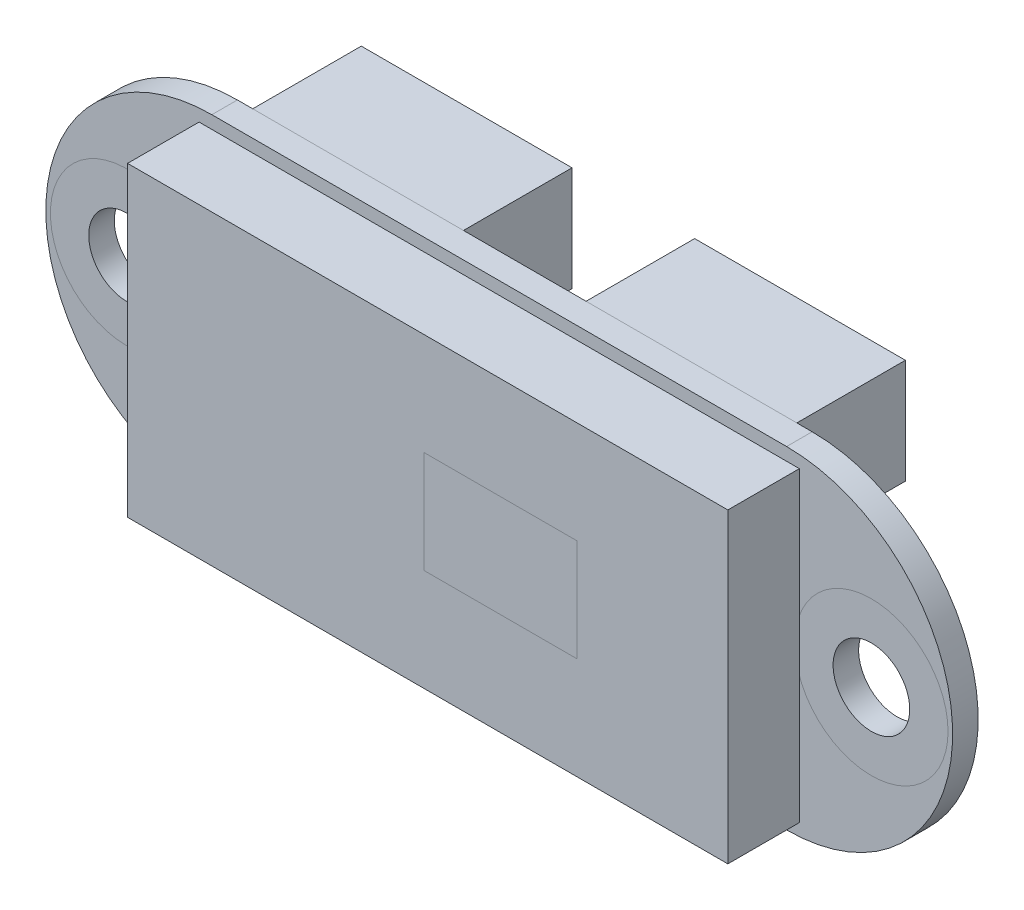
ISO-10303-21;
HEADER;
FILE_DESCRIPTION(('STEP AP214'),'2;1');
FILE_NAME('part.step','',(''),(''),'','','');
FILE_SCHEMA(('AUTOMOTIVE_DESIGN { 1 0 10303 214 1 1 1 1 }'));
ENDSEC;
DATA;
#1=APPLICATION_CONTEXT('core data for automotive mechanical design processes');
#2=APPLICATION_PROTOCOL_DEFINITION('international standard','automotive_design',2000,#1);
#3=PRODUCT_CONTEXT('',#1,'mechanical');
#4=PRODUCT('Part','Part','',(#3));
#5=PRODUCT_RELATED_PRODUCT_CATEGORY('part','',(#4));
#6=PRODUCT_DEFINITION_FORMATION('','',#4);
#7=PRODUCT_DEFINITION_CONTEXT('part definition',#1,'design');
#8=PRODUCT_DEFINITION('design','',#6,#7);
#9=PRODUCT_DEFINITION_SHAPE('','',#8);
#10=(LENGTH_UNIT() NAMED_UNIT(*) SI_UNIT(.MILLI.,.METRE.));
#11=(NAMED_UNIT(*) PLANE_ANGLE_UNIT() SI_UNIT($,.RADIAN.));
#12=(NAMED_UNIT(*) SI_UNIT($,.STERADIAN.) SOLID_ANGLE_UNIT());
#13=UNCERTAINTY_MEASURE_WITH_UNIT(LENGTH_MEASURE(1.E-05),#10,'distance_accuracy_value','');
#14=(GEOMETRIC_REPRESENTATION_CONTEXT(3) GLOBAL_UNCERTAINTY_ASSIGNED_CONTEXT((#13)) GLOBAL_UNIT_ASSIGNED_CONTEXT((#10,
#11,#12)) REPRESENTATION_CONTEXT('',''));
#15=CARTESIAN_POINT('',(0.,0.,0.));
#16=DIRECTION('',(0.,0.,1.));
#17=DIRECTION('',(1.,0.,0.));
#18=AXIS2_PLACEMENT_3D('',#15,#16,#17);
#19=CARTESIAN_POINT('',(-40.6608038878916,21.8666569572126,-4.25));
#20=DIRECTION('',(-1.,0.,0.));
#21=DIRECTION('',(0.,0.,1.));
#22=AXIS2_PLACEMENT_3D('',#19,#20,#21);
#23=PLANE('',#22);
#24=DIRECTION('',(0.,-1.,0.));
#25=VECTOR('',#24,1.);
#26=CARTESIAN_POINT('',(-40.6608038878916,21.8666569572126,0.));
#27=LINE('',#26,#25);
#28=CARTESIAN_POINT('',(-40.6608038878916,21.8666569572126,0.));
#29=VERTEX_POINT('',#28);
#30=CARTESIAN_POINT('',(-40.6608038878916,17.7666569572126,0.));
#31=VERTEX_POINT('',#30);
#32=EDGE_CURVE('E115',#29,#31,#27,.T.);
#33=ORIENTED_EDGE('',*,*,#32,.T.);
#34=DIRECTION('',(0.,0.,1.));
#35=VECTOR('',#34,1.);
#36=CARTESIAN_POINT('',(-40.6608038878916,17.7666569572126,-4.25));
#37=LINE('',#36,#35);
#38=CARTESIAN_POINT('',(-40.6608038878916,17.7666569572126,-4.25));
#39=VERTEX_POINT('',#38);
#40=EDGE_CURVE('E12',#39,#31,#37,.T.);
#41=ORIENTED_EDGE('',*,*,#40,.F.);
#42=DIRECTION('',(0.,-1.,0.));
#43=VECTOR('',#42,1.);
#44=CARTESIAN_POINT('',(-40.6608038878916,21.8666569572126,-4.25));
#45=LINE('',#44,#43);
#46=CARTESIAN_POINT('',(-40.6608038878916,21.8666569572126,-4.25));
#47=VERTEX_POINT('',#46);
#48=EDGE_CURVE('E103',#47,#39,#45,.T.);
#49=ORIENTED_EDGE('',*,*,#48,.F.);
#50=DIRECTION('',(0.,0.,1.));
#51=VECTOR('',#50,1.);
#52=CARTESIAN_POINT('',(-40.6608038878916,21.8666569572126,-4.25));
#53=LINE('',#52,#51);
#54=EDGE_CURVE('E111',#47,#29,#53,.T.);
#55=ORIENTED_EDGE('',*,*,#54,.T.);
#56=EDGE_LOOP('',(#33,#41,#49,#55));
#57=FACE_BOUND('',#56,.T.);
#58=ADVANCED_FACE('F52',(#57),#23,.F.);
#59=CARTESIAN_POINT('',(-40.6608038878916,17.7666569572126,-4.25));
#60=DIRECTION('',(0.,1.,0.));
#61=DIRECTION('',(0.,0.,1.));
#62=AXIS2_PLACEMENT_3D('',#59,#60,#61);
#63=PLANE('',#62);
#64=DIRECTION('',(-1.,0.,0.));
#65=VECTOR('',#64,1.);
#66=CARTESIAN_POINT('',(-40.6608038878916,17.7666569572126,0.));
#67=LINE('',#66,#65);
#68=CARTESIAN_POINT('',(-48.9108038878916,17.7666569572126,0.));
#69=VERTEX_POINT('',#68);
#70=EDGE_CURVE('E107',#31,#69,#67,.T.);
#71=ORIENTED_EDGE('',*,*,#70,.T.);
#72=DIRECTION('',(0.,0.,1.));
#73=VECTOR('',#72,1.);
#74=CARTESIAN_POINT('',(-48.9108038878916,17.7666569572126,-4.25));
#75=LINE('',#74,#73);
#76=CARTESIAN_POINT('',(-48.9108038878916,17.7666569572126,-4.25));
#77=VERTEX_POINT('',#76);
#78=EDGE_CURVE('E60',#77,#69,#75,.T.);
#79=ORIENTED_EDGE('',*,*,#78,.F.);
#80=DIRECTION('',(-1.,0.,0.));
#81=VECTOR('',#80,1.);
#82=CARTESIAN_POINT('',(-40.6608038878916,17.7666569572126,-4.25));
#83=LINE('',#82,#81);
#84=EDGE_CURVE('E98',#39,#77,#83,.T.);
#85=ORIENTED_EDGE('',*,*,#84,.F.);
#86=ORIENTED_EDGE('',*,*,#40,.T.);
#87=EDGE_LOOP('',(#71,#79,#85,#86));
#88=FACE_BOUND('',#87,.T.);
#89=ADVANCED_FACE('F106',(#88),#63,.F.);
#90=CARTESIAN_POINT('',(-48.9108038878916,21.8666569572126,-4.25));
#91=DIRECTION('',(1.,0.,0.));
#92=DIRECTION('',(0.,0.,-1.));
#93=AXIS2_PLACEMENT_3D('',#90,#91,#92);
#94=PLANE('',#93);
#95=DIRECTION('',(0.,1.,0.));
#96=VECTOR('',#95,1.);
#97=CARTESIAN_POINT('',(-48.9108038878916,21.8666569572126,0.));
#98=LINE('',#97,#96);
#99=CARTESIAN_POINT('',(-48.9108038878916,21.8666569572126,0.));
#100=VERTEX_POINT('',#99);
#101=EDGE_CURVE('E85',#69,#100,#98,.T.);
#102=ORIENTED_EDGE('',*,*,#101,.T.);
#103=DIRECTION('',(0.,0.,1.));
#104=VECTOR('',#103,1.);
#105=CARTESIAN_POINT('',(-48.9108038878916,21.8666569572126,-4.25));
#106=LINE('',#105,#104);
#107=CARTESIAN_POINT('',(-48.9108038878916,21.8666569572126,-4.25));
#108=VERTEX_POINT('',#107);
#109=EDGE_CURVE('E108',#108,#100,#106,.T.);
#110=ORIENTED_EDGE('',*,*,#109,.F.);
#111=DIRECTION('',(0.,1.,0.));
#112=VECTOR('',#111,1.);
#113=CARTESIAN_POINT('',(-48.9108038878916,21.8666569572126,-4.25));
#114=LINE('',#113,#112);
#115=EDGE_CURVE('E101',#77,#108,#114,.T.);
#116=ORIENTED_EDGE('',*,*,#115,.F.);
#117=ORIENTED_EDGE('',*,*,#78,.T.);
#118=EDGE_LOOP('',(#102,#110,#116,#117));
#119=FACE_BOUND('',#118,.T.);
#120=ADVANCED_FACE('F109',(#119),#94,.F.);
#121=CARTESIAN_POINT('',(-40.6608038878916,21.8666569572126,-4.25));
#122=DIRECTION('',(0.,-1.,0.));
#123=DIRECTION('',(0.,0.,-1.));
#124=AXIS2_PLACEMENT_3D('',#121,#122,#123);
#125=PLANE('',#124);
#126=DIRECTION('',(1.,0.,0.));
#127=VECTOR('',#126,1.);
#128=CARTESIAN_POINT('',(-40.6608038878916,21.8666569572126,0.));
#129=LINE('',#128,#127);
#130=EDGE_CURVE('E91',#100,#29,#129,.T.);
#131=ORIENTED_EDGE('',*,*,#130,.T.);
#132=ORIENTED_EDGE('',*,*,#54,.F.);
#133=DIRECTION('',(1.,0.,0.));
#134=VECTOR('',#133,1.);
#135=CARTESIAN_POINT('',(-40.6608038878916,21.8666569572126,-4.25));
#136=LINE('',#135,#134);
#137=EDGE_CURVE('E68',#108,#47,#136,.T.);
#138=ORIENTED_EDGE('',*,*,#137,.F.);
#139=ORIENTED_EDGE('',*,*,#109,.T.);
#140=EDGE_LOOP('',(#131,#132,#138,#139));
#141=FACE_BOUND('',#140,.T.);
#142=ADVANCED_FACE('F122',(#141),#125,.F.);
#143=CARTESIAN_POINT('',(0.,0.,-4.25));
#144=DIRECTION('',(0.,0.,-1.));
#145=DIRECTION('',(-1.,0.,0.));
#146=AXIS2_PLACEMENT_3D('',#143,#144,#145);
#147=PLANE('',#146);
#148=ORIENTED_EDGE('',*,*,#48,.T.);
#149=ORIENTED_EDGE('',*,*,#84,.T.);
#150=ORIENTED_EDGE('',*,*,#115,.T.);
#151=ORIENTED_EDGE('',*,*,#137,.T.);
#152=EDGE_LOOP('',(#148,#149,#150,#151));
#153=FACE_BOUND('',#152,.T.);
#154=ADVANCED_FACE('F99',(#153),#147,.T.);
#155=CARTESIAN_POINT('',(0.,0.,0.));
#156=DIRECTION('',(0.,0.,-1.));
#157=DIRECTION('',(-1.,0.,0.));
#158=AXIS2_PLACEMENT_3D('',#155,#156,#157);
#159=PLANE('',#158);
#160=ORIENTED_EDGE('',*,*,#32,.F.);
#161=ORIENTED_EDGE('',*,*,#130,.F.);
#162=ORIENTED_EDGE('',*,*,#101,.F.);
#163=ORIENTED_EDGE('',*,*,#70,.F.);
#164=EDGE_LOOP('',(#160,#161,#162,#163));
#165=FACE_BOUND('',#164,.T.);
#166=ADVANCED_FACE('F125',(#165),#159,.F.);
#167=CLOSED_SHELL('',(#58,#89,#120,#142,#154,#166));
#168=MANIFOLD_SOLID_BREP('B2',#167);
#169=CARTESIAN_POINT('',(-27.6108038878916,21.8666569572126,-4.25));
#170=DIRECTION('',(-1.,0.,0.));
#171=DIRECTION('',(0.,-1.,0.));
#172=AXIS2_PLACEMENT_3D('',#169,#170,#171);
#173=PLANE('',#172);
#174=DIRECTION('',(0.,-1.,0.));
#175=VECTOR('',#174,1.);
#176=CARTESIAN_POINT('',(-27.6108038878916,21.8666569572126,0.));
#177=LINE('',#176,#175);
#178=CARTESIAN_POINT('',(-27.6108038878916,21.8666569572126,0.));
#179=VERTEX_POINT('',#178);
#180=CARTESIAN_POINT('',(-27.6108038878916,17.7666569572126,0.));
#181=VERTEX_POINT('',#180);
#182=EDGE_CURVE('E249',#179,#181,#177,.T.);
#183=ORIENTED_EDGE('',*,*,#182,.T.);
#184=DIRECTION('',(0.,0.,1.));
#185=VECTOR('',#184,1.);
#186=CARTESIAN_POINT('',(-27.6108038878916,17.7666569572126,-4.25));
#187=LINE('',#186,#185);
#188=CARTESIAN_POINT('',(-27.6108038878916,17.7666569572126,-4.25));
#189=VERTEX_POINT('',#188);
#190=EDGE_CURVE('E50',#189,#181,#187,.T.);
#191=ORIENTED_EDGE('',*,*,#190,.F.);
#192=DIRECTION('',(0.,-1.,0.));
#193=VECTOR('',#192,1.);
#194=CARTESIAN_POINT('',(-27.6108038878916,21.8666569572126,-4.25));
#195=LINE('',#194,#193);
#196=CARTESIAN_POINT('',(-27.6108038878916,21.8666569572126,-4.25));
#197=VERTEX_POINT('',#196);
#198=EDGE_CURVE('E237',#197,#189,#195,.T.);
#199=ORIENTED_EDGE('',*,*,#198,.F.);
#200=DIRECTION('',(0.,0.,1.));
#201=VECTOR('',#200,1.);
#202=CARTESIAN_POINT('',(-27.6108038878916,21.8666569572126,-4.25));
#203=LINE('',#202,#201);
#204=EDGE_CURVE('E245',#197,#179,#203,.T.);
#205=ORIENTED_EDGE('',*,*,#204,.T.);
#206=EDGE_LOOP('',(#183,#191,#199,#205));
#207=FACE_BOUND('',#206,.T.);
#208=ADVANCED_FACE('F186',(#207),#173,.F.);
#209=CARTESIAN_POINT('',(-27.6108038878916,17.7666569572126,-4.25));
#210=DIRECTION('',(0.,1.,0.));
#211=DIRECTION('',(0.,0.,1.));
#212=AXIS2_PLACEMENT_3D('',#209,#210,#211);
#213=PLANE('',#212);
#214=DIRECTION('',(-1.,0.,0.));
#215=VECTOR('',#214,1.);
#216=CARTESIAN_POINT('',(-27.6108038878916,17.7666569572126,0.));
#217=LINE('',#216,#215);
#218=CARTESIAN_POINT('',(-35.8608038878916,17.7666569572126,0.));
#219=VERTEX_POINT('',#218);
#220=EDGE_CURVE('E241',#181,#219,#217,.T.);
#221=ORIENTED_EDGE('',*,*,#220,.T.);
#222=DIRECTION('',(0.,0.,1.));
#223=VECTOR('',#222,1.);
#224=CARTESIAN_POINT('',(-35.8608038878916,17.7666569572126,-4.25));
#225=LINE('',#224,#223);
#226=CARTESIAN_POINT('',(-35.8608038878916,17.7666569572126,-4.25));
#227=VERTEX_POINT('',#226);
#228=EDGE_CURVE('E194',#227,#219,#225,.T.);
#229=ORIENTED_EDGE('',*,*,#228,.F.);
#230=DIRECTION('',(-1.,0.,0.));
#231=VECTOR('',#230,1.);
#232=CARTESIAN_POINT('',(-27.6108038878916,17.7666569572126,-4.25));
#233=LINE('',#232,#231);
#234=EDGE_CURVE('E232',#189,#227,#233,.T.);
#235=ORIENTED_EDGE('',*,*,#234,.F.);
#236=ORIENTED_EDGE('',*,*,#190,.T.);
#237=EDGE_LOOP('',(#221,#229,#235,#236));
#238=FACE_BOUND('',#237,.T.);
#239=ADVANCED_FACE('F240',(#238),#213,.F.);
#240=CARTESIAN_POINT('',(-35.8608038878916,21.8666569572126,-4.25));
#241=DIRECTION('',(1.,0.,0.));
#242=DIRECTION('',(0.,1.,0.));
#243=AXIS2_PLACEMENT_3D('',#240,#241,#242);
#244=PLANE('',#243);
#245=DIRECTION('',(0.,1.,0.));
#246=VECTOR('',#245,1.);
#247=CARTESIAN_POINT('',(-35.8608038878916,21.8666569572126,0.));
#248=LINE('',#247,#246);
#249=CARTESIAN_POINT('',(-35.8608038878916,21.8666569572126,0.));
#250=VERTEX_POINT('',#249);
#251=EDGE_CURVE('E219',#219,#250,#248,.T.);
#252=ORIENTED_EDGE('',*,*,#251,.T.);
#253=DIRECTION('',(0.,0.,1.));
#254=VECTOR('',#253,1.);
#255=CARTESIAN_POINT('',(-35.8608038878916,21.8666569572126,-4.25));
#256=LINE('',#255,#254);
#257=CARTESIAN_POINT('',(-35.8608038878916,21.8666569572126,-4.25));
#258=VERTEX_POINT('',#257);
#259=EDGE_CURVE('E242',#258,#250,#256,.T.);
#260=ORIENTED_EDGE('',*,*,#259,.F.);
#261=DIRECTION('',(0.,1.,0.));
#262=VECTOR('',#261,1.);
#263=CARTESIAN_POINT('',(-35.8608038878916,21.8666569572126,-4.25));
#264=LINE('',#263,#262);
#265=EDGE_CURVE('E235',#227,#258,#264,.T.);
#266=ORIENTED_EDGE('',*,*,#265,.F.);
#267=ORIENTED_EDGE('',*,*,#228,.T.);
#268=EDGE_LOOP('',(#252,#260,#266,#267));
#269=FACE_BOUND('',#268,.T.);
#270=ADVANCED_FACE('F243',(#269),#244,.F.);
#271=CARTESIAN_POINT('',(-27.6108038878916,21.8666569572126,-4.25));
#272=DIRECTION('',(0.,-1.,0.));
#273=DIRECTION('',(0.,0.,-1.));
#274=AXIS2_PLACEMENT_3D('',#271,#272,#273);
#275=PLANE('',#274);
#276=DIRECTION('',(1.,0.,0.));
#277=VECTOR('',#276,1.);
#278=CARTESIAN_POINT('',(-27.6108038878916,21.8666569572126,0.));
#279=LINE('',#278,#277);
#280=EDGE_CURVE('E225',#250,#179,#279,.T.);
#281=ORIENTED_EDGE('',*,*,#280,.T.);
#282=ORIENTED_EDGE('',*,*,#204,.F.);
#283=DIRECTION('',(1.,0.,0.));
#284=VECTOR('',#283,1.);
#285=CARTESIAN_POINT('',(-27.6108038878916,21.8666569572126,-4.25));
#286=LINE('',#285,#284);
#287=EDGE_CURVE('E202',#258,#197,#286,.T.);
#288=ORIENTED_EDGE('',*,*,#287,.F.);
#289=ORIENTED_EDGE('',*,*,#259,.T.);
#290=EDGE_LOOP('',(#281,#282,#288,#289));
#291=FACE_BOUND('',#290,.T.);
#292=ADVANCED_FACE('F256',(#291),#275,.F.);
#293=CARTESIAN_POINT('',(0.,0.,-4.25));
#294=DIRECTION('',(0.,0.,-1.));
#295=DIRECTION('',(-1.,0.,0.));
#296=AXIS2_PLACEMENT_3D('',#293,#294,#295);
#297=PLANE('',#296);
#298=ORIENTED_EDGE('',*,*,#198,.T.);
#299=ORIENTED_EDGE('',*,*,#234,.T.);
#300=ORIENTED_EDGE('',*,*,#265,.T.);
#301=ORIENTED_EDGE('',*,*,#287,.T.);
#302=EDGE_LOOP('',(#298,#299,#300,#301));
#303=FACE_BOUND('',#302,.T.);
#304=ADVANCED_FACE('F233',(#303),#297,.T.);
#305=CARTESIAN_POINT('',(0.,0.,0.));
#306=DIRECTION('',(0.,0.,-1.));
#307=DIRECTION('',(-1.,0.,0.));
#308=AXIS2_PLACEMENT_3D('',#305,#306,#307);
#309=PLANE('',#308);
#310=ORIENTED_EDGE('',*,*,#182,.F.);
#311=ORIENTED_EDGE('',*,*,#280,.F.);
#312=ORIENTED_EDGE('',*,*,#251,.F.);
#313=ORIENTED_EDGE('',*,*,#220,.F.);
#314=EDGE_LOOP('',(#310,#311,#312,#313));
#315=FACE_BOUND('',#314,.T.);
#316=ADVANCED_FACE('F259',(#315),#309,.F.);
#317=CLOSED_SHELL('',(#208,#239,#270,#292,#304,#316));
#318=MANIFOLD_SOLID_BREP('B6',#317);
#319=CARTESIAN_POINT('',(-38.4108038878916,17.3666569572126,1.));
#320=DIRECTION('',(-1.,0.,0.));
#321=DIRECTION('',(0.,0.,1.));
#322=AXIS2_PLACEMENT_3D('',#319,#320,#321);
#323=PLANE('',#322);
#324=DIRECTION('',(0.,-1.,0.));
#325=VECTOR('',#324,1.);
#326=CARTESIAN_POINT('',(-38.4108038878916,17.3666569572126,3.8));
#327=LINE('',#326,#325);
#328=CARTESIAN_POINT('',(-38.4108038878916,17.3666569572126,3.8));
#329=VERTEX_POINT('',#328);
#330=CARTESIAN_POINT('',(-38.4108038878916,13.3666569572126,3.8));
#331=VERTEX_POINT('',#330);
#332=EDGE_CURVE('E384',#329,#331,#327,.T.);
#333=ORIENTED_EDGE('',*,*,#332,.F.);
#334=DIRECTION('',(0.,0.,1.));
#335=VECTOR('',#334,1.);
#336=CARTESIAN_POINT('',(-38.4108038878916,17.3666569572126,1.));
#337=LINE('',#336,#335);
#338=CARTESIAN_POINT('',(-38.4108038878916,17.3666569572126,1.));
#339=VERTEX_POINT('',#338);
#340=EDGE_CURVE('E184',#339,#329,#337,.T.);
#341=ORIENTED_EDGE('',*,*,#340,.F.);
#342=DIRECTION('',(0.,-1.,0.));
#343=VECTOR('',#342,1.);
#344=CARTESIAN_POINT('',(-38.4108038878916,17.3666569572126,1.));
#345=LINE('',#344,#343);
#346=CARTESIAN_POINT('',(-38.4108038878916,13.3666569572126,1.));
#347=VERTEX_POINT('',#346);
#348=EDGE_CURVE('E378',#339,#347,#345,.T.);
#349=ORIENTED_EDGE('',*,*,#348,.T.);
#350=DIRECTION('',(0.,0.,1.));
#351=VECTOR('',#350,1.);
#352=CARTESIAN_POINT('',(-38.4108038878916,13.3666569572126,1.));
#353=LINE('',#352,#351);
#354=EDGE_CURVE('E323',#347,#331,#353,.T.);
#355=ORIENTED_EDGE('',*,*,#354,.T.);
#356=EDGE_LOOP('',(#333,#341,#349,#355));
#357=FACE_BOUND('',#356,.T.);
#358=ADVANCED_FACE('F320',(#357),#323,.T.);
#359=CARTESIAN_POINT('',(-38.4108038878916,17.3666569572126,1.));
#360=DIRECTION('',(0.,1.,0.));
#361=DIRECTION('',(0.,0.,1.));
#362=AXIS2_PLACEMENT_3D('',#359,#360,#361);
#363=PLANE('',#362);
#364=DIRECTION('',(-1.,0.,0.));
#365=VECTOR('',#364,1.);
#366=CARTESIAN_POINT('',(-38.4108038878916,17.3666569572126,3.8));
#367=LINE('',#366,#365);
#368=CARTESIAN_POINT('',(-32.4108038878916,17.3666569572126,3.8));
#369=VERTEX_POINT('',#368);
#370=EDGE_CURVE('E380',#369,#329,#367,.T.);
#371=ORIENTED_EDGE('',*,*,#370,.F.);
#372=DIRECTION('',(0.,0.,1.));
#373=VECTOR('',#372,1.);
#374=CARTESIAN_POINT('',(-32.4108038878916,17.3666569572126,1.));
#375=LINE('',#374,#373);
#376=CARTESIAN_POINT('',(-32.4108038878916,17.3666569572126,1.));
#377=VERTEX_POINT('',#376);
#378=EDGE_CURVE('E329',#377,#369,#375,.T.);
#379=ORIENTED_EDGE('',*,*,#378,.F.);
#380=DIRECTION('',(-1.,0.,0.));
#381=VECTOR('',#380,1.);
#382=CARTESIAN_POINT('',(-38.4108038878916,17.3666569572126,1.));
#383=LINE('',#382,#381);
#384=EDGE_CURVE('E375',#377,#339,#383,.T.);
#385=ORIENTED_EDGE('',*,*,#384,.T.);
#386=ORIENTED_EDGE('',*,*,#340,.T.);
#387=EDGE_LOOP('',(#371,#379,#385,#386));
#388=FACE_BOUND('',#387,.T.);
#389=ADVANCED_FACE('F394',(#388),#363,.T.);
#390=CARTESIAN_POINT('',(-32.4108038878916,17.3666569572126,1.));
#391=DIRECTION('',(1.,0.,0.));
#392=DIRECTION('',(0.,0.,-1.));
#393=AXIS2_PLACEMENT_3D('',#390,#391,#392);
#394=PLANE('',#393);
#395=DIRECTION('',(0.,1.,0.));
#396=VECTOR('',#395,1.);
#397=CARTESIAN_POINT('',(-32.4108038878916,17.3666569572126,3.8));
#398=LINE('',#397,#396);
#399=CARTESIAN_POINT('',(-32.4108038878916,13.3666569572126,3.8));
#400=VERTEX_POINT('',#399);
#401=EDGE_CURVE('E370',#400,#369,#398,.T.);
#402=ORIENTED_EDGE('',*,*,#401,.F.);
#403=DIRECTION('',(0.,0.,1.));
#404=VECTOR('',#403,1.);
#405=CARTESIAN_POINT('',(-32.4108038878916,13.3666569572126,1.));
#406=LINE('',#405,#404);
#407=CARTESIAN_POINT('',(-32.4108038878916,13.3666569572126,1.));
#408=VERTEX_POINT('',#407);
#409=EDGE_CURVE('E365',#408,#400,#406,.T.);
#410=ORIENTED_EDGE('',*,*,#409,.F.);
#411=DIRECTION('',(0.,1.,0.));
#412=VECTOR('',#411,1.);
#413=CARTESIAN_POINT('',(-32.4108038878916,17.3666569572126,1.));
#414=LINE('',#413,#412);
#415=EDGE_CURVE('E368',#408,#377,#414,.T.);
#416=ORIENTED_EDGE('',*,*,#415,.T.);
#417=ORIENTED_EDGE('',*,*,#378,.T.);
#418=EDGE_LOOP('',(#402,#410,#416,#417));
#419=FACE_BOUND('',#418,.T.);
#420=ADVANCED_FACE('F367',(#419),#394,.T.);
#421=CARTESIAN_POINT('',(-38.4108038878916,13.3666569572126,1.));
#422=DIRECTION('',(0.,-1.,0.));
#423=DIRECTION('',(0.,0.,-1.));
#424=AXIS2_PLACEMENT_3D('',#421,#422,#423);
#425=PLANE('',#424);
#426=DIRECTION('',(1.,0.,0.));
#427=VECTOR('',#426,1.);
#428=CARTESIAN_POINT('',(-38.4108038878916,13.3666569572126,3.8));
#429=LINE('',#428,#427);
#430=EDGE_CURVE('E387',#331,#400,#429,.T.);
#431=ORIENTED_EDGE('',*,*,#430,.F.);
#432=ORIENTED_EDGE('',*,*,#354,.F.);
#433=DIRECTION('',(1.,0.,0.));
#434=VECTOR('',#433,1.);
#435=CARTESIAN_POINT('',(-38.4108038878916,13.3666569572126,1.));
#436=LINE('',#435,#434);
#437=EDGE_CURVE('E374',#347,#408,#436,.T.);
#438=ORIENTED_EDGE('',*,*,#437,.T.);
#439=ORIENTED_EDGE('',*,*,#409,.T.);
#440=EDGE_LOOP('',(#431,#432,#438,#439));
#441=FACE_BOUND('',#440,.T.);
#442=ADVANCED_FACE('F377',(#441),#425,.T.);
#443=CARTESIAN_POINT('',(0.,0.,1.));
#444=DIRECTION('',(0.,0.,1.));
#445=DIRECTION('',(1.,0.,0.));
#446=AXIS2_PLACEMENT_3D('',#443,#444,#445);
#447=PLANE('',#446);
#448=ORIENTED_EDGE('',*,*,#348,.F.);
#449=ORIENTED_EDGE('',*,*,#384,.F.);
#450=ORIENTED_EDGE('',*,*,#415,.F.);
#451=ORIENTED_EDGE('',*,*,#437,.F.);
#452=EDGE_LOOP('',(#448,#449,#450,#451));
#453=FACE_BOUND('',#452,.T.);
#454=ADVANCED_FACE('F373',(#453),#447,.F.);
#455=CARTESIAN_POINT('',(0.,0.,3.8));
#456=DIRECTION('',(0.,0.,1.));
#457=DIRECTION('',(1.,0.,0.));
#458=AXIS2_PLACEMENT_3D('',#455,#456,#457);
#459=PLANE('',#458);
#460=ORIENTED_EDGE('',*,*,#332,.T.);
#461=ORIENTED_EDGE('',*,*,#430,.T.);
#462=ORIENTED_EDGE('',*,*,#401,.T.);
#463=ORIENTED_EDGE('',*,*,#370,.T.);
#464=EDGE_LOOP('',(#460,#461,#462,#463));
#465=FACE_BOUND('',#464,.T.);
#466=ADVANCED_FACE('F393',(#465),#459,.T.);
#467=CLOSED_SHELL('',(#358,#389,#420,#442,#454,#466));
#468=MANIFOLD_SOLID_BREP('B44',#467);
#469=CARTESIAN_POINT('',(0.,0.,3.8));
#470=DIRECTION('',(0.,0.,1.));
#471=DIRECTION('',(1.,0.,0.));
#472=AXIS2_PLACEMENT_3D('',#469,#470,#471);
#473=PLANE('',#472);
#474=DIRECTION('',(0.,-1.,0.));
#475=VECTOR('',#474,1.);
#476=CARTESIAN_POINT('',(-50.0108038878916,21.3666569572126,3.8));
#477=LINE('',#476,#475);
#478=CARTESIAN_POINT('',(-50.0108038878916,21.3666569572126,3.8));
#479=VERTEX_POINT('',#478);
#480=CARTESIAN_POINT('',(-50.0108038878916,9.36665695721256,3.8));
#481=VERTEX_POINT('',#480);
#482=EDGE_CURVE('E566',#479,#481,#477,.T.);
#483=ORIENTED_EDGE('',*,*,#482,.T.);
#484=DIRECTION('',(1.,0.,0.));
#485=VECTOR('',#484,1.);
#486=CARTESIAN_POINT('',(-50.0108038878916,9.36665695721256,3.8));
#487=LINE('',#486,#485);
#488=CARTESIAN_POINT('',(-26.5108038878916,9.36665695721257,3.8));
#489=VERTEX_POINT('',#488);
#490=EDGE_CURVE('E570',#481,#489,#487,.T.);
#491=ORIENTED_EDGE('',*,*,#490,.T.);
#492=DIRECTION('',(0.,1.,0.));
#493=VECTOR('',#492,1.);
#494=CARTESIAN_POINT('',(-26.5108038878916,21.3666569572126,3.8));
#495=LINE('',#494,#493);
#496=CARTESIAN_POINT('',(-26.5108038878916,21.3666569572126,3.8));
#497=VERTEX_POINT('',#496);
#498=EDGE_CURVE('E574',#489,#497,#495,.T.);
#499=ORIENTED_EDGE('',*,*,#498,.T.);
#500=DIRECTION('',(-1.,0.,0.));
#501=VECTOR('',#500,1.);
#502=CARTESIAN_POINT('',(-50.0108038878916,21.3666569572126,3.8));
#503=LINE('',#502,#501);
#504=EDGE_CURVE('E577',#497,#479,#503,.T.);
#505=ORIENTED_EDGE('',*,*,#504,.T.);
#506=EDGE_LOOP('',(#483,#491,#499,#505));
#507=FACE_BOUND('',#506,.T.);
#508=DIRECTION('',(1.,0.,0.));
#509=VECTOR('',#508,1.);
#510=CARTESIAN_POINT('',(-38.4108038878916,13.3666569572126,3.8));
#511=LINE('',#510,#509);
#512=CARTESIAN_POINT('',(-38.4108038878916,13.3666569572126,3.8));
#513=VERTEX_POINT('',#512);
#514=CARTESIAN_POINT('',(-32.4108038878916,13.3666569572126,3.8));
#515=VERTEX_POINT('',#514);
#516=EDGE_CURVE('E527',#513,#515,#511,.T.);
#517=ORIENTED_EDGE('',*,*,#516,.F.);
#518=DIRECTION('',(0.,-1.,0.));
#519=VECTOR('',#518,1.);
#520=CARTESIAN_POINT('',(-38.4108038878916,17.3666569572126,3.8));
#521=LINE('',#520,#519);
#522=CARTESIAN_POINT('',(-38.4108038878916,17.3666569572126,3.8));
#523=VERTEX_POINT('',#522);
#524=EDGE_CURVE('E518',#523,#513,#521,.T.);
#525=ORIENTED_EDGE('',*,*,#524,.F.);
#526=DIRECTION('',(-1.,0.,0.));
#527=VECTOR('',#526,1.);
#528=CARTESIAN_POINT('',(-38.4108038878916,17.3666569572126,3.8));
#529=LINE('',#528,#527);
#530=CARTESIAN_POINT('',(-32.4108038878916,17.3666569572126,3.8));
#531=VERTEX_POINT('',#530);
#532=EDGE_CURVE('E544',#531,#523,#529,.T.);
#533=ORIENTED_EDGE('',*,*,#532,.F.);
#534=DIRECTION('',(0.,1.,0.));
#535=VECTOR('',#534,1.);
#536=CARTESIAN_POINT('',(-32.4108038878916,17.3666569572126,3.8));
#537=LINE('',#536,#535);
#538=EDGE_CURVE('E540',#515,#531,#537,.T.);
#539=ORIENTED_EDGE('',*,*,#538,.F.);
#540=EDGE_LOOP('',(#517,#525,#533,#539));
#541=FACE_BOUND('',#540,.T.);
#542=ADVANCED_FACE('F452',(#507,#541),#473,.T.);
#543=CARTESIAN_POINT('',(0.,0.,1.));
#544=DIRECTION('',(0.,0.,1.));
#545=DIRECTION('',(1.,0.,0.));
#546=AXIS2_PLACEMENT_3D('',#543,#544,#545);
#547=PLANE('',#546);
#548=DIRECTION('',(0.,-1.,0.));
#549=VECTOR('',#548,1.);
#550=CARTESIAN_POINT('',(-50.0108038878916,21.3666569572126,1.));
#551=LINE('',#550,#549);
#552=CARTESIAN_POINT('',(-50.0108038878916,21.3666569572126,1.));
#553=VERTEX_POINT('',#552);
#554=CARTESIAN_POINT('',(-50.0108038878916,9.36665695721256,1.));
#555=VERTEX_POINT('',#554);
#556=EDGE_CURVE('E536',#553,#555,#551,.T.);
#557=ORIENTED_EDGE('',*,*,#556,.F.);
#558=DIRECTION('',(-1.,0.,0.));
#559=VECTOR('',#558,1.);
#560=CARTESIAN_POINT('',(-50.0108038878916,21.3666569572126,1.));
#561=LINE('',#560,#559);
#562=CARTESIAN_POINT('',(-26.5108038878916,21.3666569572126,1.));
#563=VERTEX_POINT('',#562);
#564=EDGE_CURVE('E571',#563,#553,#561,.T.);
#565=ORIENTED_EDGE('',*,*,#564,.F.);
#566=DIRECTION('',(0.,1.,0.));
#567=VECTOR('',#566,1.);
#568=CARTESIAN_POINT('',(-26.5108038878916,21.3666569572126,1.));
#569=LINE('',#568,#567);
#570=CARTESIAN_POINT('',(-26.5108038878916,9.36665695721257,1.));
#571=VERTEX_POINT('',#570);
#572=EDGE_CURVE('E587',#571,#563,#569,.T.);
#573=ORIENTED_EDGE('',*,*,#572,.F.);
#574=DIRECTION('',(1.,0.,0.));
#575=VECTOR('',#574,1.);
#576=CARTESIAN_POINT('',(-50.0108038878916,9.36665695721256,1.));
#577=LINE('',#576,#575);
#578=EDGE_CURVE('E584',#555,#571,#577,.T.);
#579=ORIENTED_EDGE('',*,*,#578,.F.);
#580=EDGE_LOOP('',(#557,#565,#573,#579));
#581=FACE_BOUND('',#580,.T.);
#582=DIRECTION('',(0.,-1.,0.));
#583=VECTOR('',#582,1.);
#584=CARTESIAN_POINT('',(-38.4108038878916,17.3666569572126,1.));
#585=LINE('',#584,#583);
#586=CARTESIAN_POINT('',(-38.4108038878916,17.3666569572126,1.));
#587=VERTEX_POINT('',#586);
#588=CARTESIAN_POINT('',(-38.4108038878916,13.3666569572126,1.));
#589=VERTEX_POINT('',#588);
#590=EDGE_CURVE('E476',#587,#589,#585,.T.);
#591=ORIENTED_EDGE('',*,*,#590,.T.);
#592=DIRECTION('',(1.,0.,0.));
#593=VECTOR('',#592,1.);
#594=CARTESIAN_POINT('',(-38.4108038878916,13.3666569572126,1.));
#595=LINE('',#594,#593);
#596=CARTESIAN_POINT('',(-32.4108038878916,13.3666569572126,1.));
#597=VERTEX_POINT('',#596);
#598=EDGE_CURVE('E534',#589,#597,#595,.T.);
#599=ORIENTED_EDGE('',*,*,#598,.T.);
#600=DIRECTION('',(0.,1.,0.));
#601=VECTOR('',#600,1.);
#602=CARTESIAN_POINT('',(-32.4108038878916,17.3666569572126,1.));
#603=LINE('',#602,#601);
#604=CARTESIAN_POINT('',(-32.4108038878916,17.3666569572126,1.));
#605=VERTEX_POINT('',#604);
#606=EDGE_CURVE('E553',#597,#605,#603,.T.);
#607=ORIENTED_EDGE('',*,*,#606,.T.);
#608=DIRECTION('',(-1.,0.,0.));
#609=VECTOR('',#608,1.);
#610=CARTESIAN_POINT('',(-38.4108038878916,17.3666569572126,1.));
#611=LINE('',#610,#609);
#612=EDGE_CURVE('E528',#605,#587,#611,.T.);
#613=ORIENTED_EDGE('',*,*,#612,.T.);
#614=EDGE_LOOP('',(#591,#599,#607,#613));
#615=FACE_BOUND('',#614,.T.);
#616=ADVANCED_FACE('F610',(#581,#615),#547,.F.);
#617=CARTESIAN_POINT('',(-50.0108038878916,21.3666569572126,3.8));
#618=DIRECTION('',(1.,0.,0.));
#619=DIRECTION('',(0.,1.,0.));
#620=AXIS2_PLACEMENT_3D('',#617,#618,#619);
#621=PLANE('',#620);
#622=ORIENTED_EDGE('',*,*,#556,.T.);
#623=DIRECTION('',(0.,0.,-1.));
#624=VECTOR('',#623,1.);
#625=CARTESIAN_POINT('',(-50.0108038878916,9.36665695721256,3.8));
#626=LINE('',#625,#624);
#627=EDGE_CURVE('E318',#481,#555,#626,.T.);
#628=ORIENTED_EDGE('',*,*,#627,.F.);
#629=ORIENTED_EDGE('',*,*,#482,.F.);
#630=DIRECTION('',(0.,0.,-1.));
#631=VECTOR('',#630,1.);
#632=CARTESIAN_POINT('',(-50.0108038878916,21.3666569572126,3.8));
#633=LINE('',#632,#631);
#634=EDGE_CURVE('E580',#479,#553,#633,.T.);
#635=ORIENTED_EDGE('',*,*,#634,.T.);
#636=EDGE_LOOP('',(#622,#628,#629,#635));
#637=FACE_BOUND('',#636,.T.);
#638=ADVANCED_FACE('F454',(#637),#621,.F.);
#639=CARTESIAN_POINT('',(-50.0108038878916,9.36665695721256,3.8));
#640=DIRECTION('',(0.,1.,0.));
#641=DIRECTION('',(-1.,0.,0.));
#642=AXIS2_PLACEMENT_3D('',#639,#640,#641);
#643=PLANE('',#642);
#644=ORIENTED_EDGE('',*,*,#578,.T.);
#645=DIRECTION('',(0.,0.,-1.));
#646=VECTOR('',#645,1.);
#647=CARTESIAN_POINT('',(-26.5108038878916,9.36665695721257,3.8));
#648=LINE('',#647,#646);
#649=EDGE_CURVE('E461',#489,#571,#648,.T.);
#650=ORIENTED_EDGE('',*,*,#649,.F.);
#651=ORIENTED_EDGE('',*,*,#490,.F.);
#652=ORIENTED_EDGE('',*,*,#627,.T.);
#653=EDGE_LOOP('',(#644,#650,#651,#652));
#654=FACE_BOUND('',#653,.T.);
#655=ADVANCED_FACE('F620',(#654),#643,.F.);
#656=CARTESIAN_POINT('',(-26.5108038878916,21.3666569572126,3.8));
#657=DIRECTION('',(-1.,0.,0.));
#658=DIRECTION('',(0.,-1.,0.));
#659=AXIS2_PLACEMENT_3D('',#656,#657,#658);
#660=PLANE('',#659);
#661=ORIENTED_EDGE('',*,*,#572,.T.);
#662=DIRECTION('',(0.,0.,-1.));
#663=VECTOR('',#662,1.);
#664=CARTESIAN_POINT('',(-26.5108038878916,21.3666569572126,3.8));
#665=LINE('',#664,#663);
#666=EDGE_CURVE('E595',#497,#563,#665,.T.);
#667=ORIENTED_EDGE('',*,*,#666,.F.);
#668=ORIENTED_EDGE('',*,*,#498,.F.);
#669=ORIENTED_EDGE('',*,*,#649,.T.);
#670=EDGE_LOOP('',(#661,#667,#668,#669));
#671=FACE_BOUND('',#670,.T.);
#672=ADVANCED_FACE('F604',(#671),#660,.F.);
#673=CARTESIAN_POINT('',(-50.0108038878916,21.3666569572126,3.8));
#674=DIRECTION('',(0.,-1.,0.));
#675=DIRECTION('',(1.,0.,0.));
#676=AXIS2_PLACEMENT_3D('',#673,#674,#675);
#677=PLANE('',#676);
#678=ORIENTED_EDGE('',*,*,#564,.T.);
#679=ORIENTED_EDGE('',*,*,#634,.F.);
#680=ORIENTED_EDGE('',*,*,#504,.F.);
#681=ORIENTED_EDGE('',*,*,#666,.T.);
#682=EDGE_LOOP('',(#678,#679,#680,#681));
#683=FACE_BOUND('',#682,.T.);
#684=ADVANCED_FACE('F614',(#683),#677,.F.);
#685=CARTESIAN_POINT('',(-38.4108038878916,17.3666569572126,3.8));
#686=DIRECTION('',(1.,0.,0.));
#687=DIRECTION('',(0.,1.,0.));
#688=AXIS2_PLACEMENT_3D('',#685,#686,#687);
#689=PLANE('',#688);
#690=ORIENTED_EDGE('',*,*,#590,.F.);
#691=DIRECTION('',(0.,0.,-1.));
#692=VECTOR('',#691,1.);
#693=CARTESIAN_POINT('',(-38.4108038878916,17.3666569572126,3.8));
#694=LINE('',#693,#692);
#695=EDGE_CURVE('E522',#523,#587,#694,.T.);
#696=ORIENTED_EDGE('',*,*,#695,.F.);
#697=ORIENTED_EDGE('',*,*,#524,.T.);
#698=DIRECTION('',(0.,0.,-1.));
#699=VECTOR('',#698,1.);
#700=CARTESIAN_POINT('',(-38.4108038878916,13.3666569572126,3.8));
#701=LINE('',#700,#699);
#702=EDGE_CURVE('E521',#513,#589,#701,.T.);
#703=ORIENTED_EDGE('',*,*,#702,.T.);
#704=EDGE_LOOP('',(#690,#696,#697,#703));
#705=FACE_BOUND('',#704,.T.);
#706=ADVANCED_FACE('F520',(#705),#689,.T.);
#707=CARTESIAN_POINT('',(-38.4108038878916,13.3666569572126,3.8));
#708=DIRECTION('',(0.,1.,0.));
#709=DIRECTION('',(0.,0.,1.));
#710=AXIS2_PLACEMENT_3D('',#707,#708,#709);
#711=PLANE('',#710);
#712=ORIENTED_EDGE('',*,*,#598,.F.);
#713=ORIENTED_EDGE('',*,*,#702,.F.);
#714=ORIENTED_EDGE('',*,*,#516,.T.);
#715=DIRECTION('',(0.,0.,-1.));
#716=VECTOR('',#715,1.);
#717=CARTESIAN_POINT('',(-32.4108038878916,13.3666569572126,3.8));
#718=LINE('',#717,#716);
#719=EDGE_CURVE('E537',#515,#597,#718,.T.);
#720=ORIENTED_EDGE('',*,*,#719,.T.);
#721=EDGE_LOOP('',(#712,#713,#714,#720));
#722=FACE_BOUND('',#721,.T.);
#723=ADVANCED_FACE('F531',(#722),#711,.T.);
#724=CARTESIAN_POINT('',(-32.4108038878916,17.3666569572126,3.8));
#725=DIRECTION('',(-1.,0.,0.));
#726=DIRECTION('',(0.,0.,1.));
#727=AXIS2_PLACEMENT_3D('',#724,#725,#726);
#728=PLANE('',#727);
#729=ORIENTED_EDGE('',*,*,#606,.F.);
#730=ORIENTED_EDGE('',*,*,#719,.F.);
#731=ORIENTED_EDGE('',*,*,#538,.T.);
#732=DIRECTION('',(0.,0.,-1.));
#733=VECTOR('',#732,1.);
#734=CARTESIAN_POINT('',(-32.4108038878916,17.3666569572126,3.8));
#735=LINE('',#734,#733);
#736=EDGE_CURVE('E468',#531,#605,#735,.T.);
#737=ORIENTED_EDGE('',*,*,#736,.T.);
#738=EDGE_LOOP('',(#729,#730,#731,#737));
#739=FACE_BOUND('',#738,.T.);
#740=ADVANCED_FACE('F643',(#739),#728,.T.);
#741=CARTESIAN_POINT('',(-38.4108038878916,17.3666569572126,3.8));
#742=DIRECTION('',(0.,-1.,0.));
#743=DIRECTION('',(1.,0.,0.));
#744=AXIS2_PLACEMENT_3D('',#741,#742,#743);
#745=PLANE('',#744);
#746=ORIENTED_EDGE('',*,*,#612,.F.);
#747=ORIENTED_EDGE('',*,*,#736,.F.);
#748=ORIENTED_EDGE('',*,*,#532,.T.);
#749=ORIENTED_EDGE('',*,*,#695,.T.);
#750=EDGE_LOOP('',(#746,#747,#748,#749));
#751=FACE_BOUND('',#750,.T.);
#752=ADVANCED_FACE('F647',(#751),#745,.T.);
#753=CLOSED_SHELL('',(#542,#616,#638,#655,#672,#684,#706,#723,#740,#752));
#754=MANIFOLD_SOLID_BREP('B178',#753);
#755=CARTESIAN_POINT('',(-52.8308038878916,15.3666569572126,0.));
#756=DIRECTION('',(0.,0.,1.));
#757=DIRECTION('',(1.,0.,0.));
#758=AXIS2_PLACEMENT_3D('',#755,#756,#757);
#759=CYLINDRICAL_SURFACE('',#758,3.);
#760=CARTESIAN_POINT('',(-52.8308038878916,15.3666569572126,0.));
#761=DIRECTION('',(0.,0.,1.));
#762=DIRECTION('',(1.,0.,0.));
#763=AXIS2_PLACEMENT_3D('',#760,#761,#762);
#764=CIRCLE('',#763,3.);
#765=CARTESIAN_POINT('',(-49.8308038878916,15.3666569572126,0.));
#766=VERTEX_POINT('',#765);
#767=EDGE_CURVE('E451',#766,#766,#764,.T.);
#768=ORIENTED_EDGE('',*,*,#767,.T.);
#769=EDGE_LOOP('',(#768));
#770=FACE_BOUND('',#769,.T.);
#771=CARTESIAN_POINT('',(-52.8308038878916,15.3666569572126,1.));
#772=DIRECTION('',(0.,0.,1.));
#773=DIRECTION('',(1.,0.,0.));
#774=AXIS2_PLACEMENT_3D('',#771,#772,#773);
#775=CIRCLE('',#774,3.);
#776=CARTESIAN_POINT('',(-49.8308038878916,15.3666569572126,1.));
#777=VERTEX_POINT('',#776);
#778=EDGE_CURVE('E717',#777,#777,#775,.T.);
#779=ORIENTED_EDGE('',*,*,#778,.F.);
#780=EDGE_LOOP('',(#779));
#781=FACE_BOUND('',#780,.T.);
#782=ADVANCED_FACE('F714',(#770,#781),#759,.T.);
#783=CARTESIAN_POINT('',(-52.8308038878916,15.3666569572126,0.));
#784=DIRECTION('',(0.,0.,1.));
#785=DIRECTION('',(1.,0.,0.));
#786=AXIS2_PLACEMENT_3D('',#783,#784,#785);
#787=PLANE('',#786);
#788=CARTESIAN_POINT('',(-52.8308038878916,15.3666569572126,0.));
#789=DIRECTION('',(0.,0.,1.));
#790=DIRECTION('',(1.,0.,0.));
#791=AXIS2_PLACEMENT_3D('',#788,#789,#790);
#792=CIRCLE('',#791,1.5);
#793=CARTESIAN_POINT('',(-51.3308038878916,15.3666569572126,0.));
#794=VERTEX_POINT('',#793);
#795=EDGE_CURVE('E724',#794,#794,#792,.T.);
#796=ORIENTED_EDGE('',*,*,#795,.T.);
#797=EDGE_LOOP('',(#796));
#798=FACE_BOUND('',#797,.T.);
#799=ORIENTED_EDGE('',*,*,#767,.F.);
#800=EDGE_LOOP('',(#799));
#801=FACE_BOUND('',#800,.T.);
#802=ADVANCED_FACE('F732',(#798,#801),#787,.F.);
#803=CARTESIAN_POINT('',(-52.8308038878916,15.3666569572126,1.));
#804=DIRECTION('',(0.,0.,1.));
#805=DIRECTION('',(1.,0.,0.));
#806=AXIS2_PLACEMENT_3D('',#803,#804,#805);
#807=PLANE('',#806);
#808=CARTESIAN_POINT('',(-52.8308038878916,15.3666569572126,1.));
#809=DIRECTION('',(0.,0.,1.));
#810=DIRECTION('',(1.,0.,0.));
#811=AXIS2_PLACEMENT_3D('',#808,#809,#810);
#812=CIRCLE('',#811,1.5);
#813=CARTESIAN_POINT('',(-51.3308038878916,15.3666569572126,1.));
#814=VERTEX_POINT('',#813);
#815=EDGE_CURVE('E726',#814,#814,#812,.T.);
#816=ORIENTED_EDGE('',*,*,#815,.F.);
#817=EDGE_LOOP('',(#816));
#818=FACE_BOUND('',#817,.T.);
#819=ORIENTED_EDGE('',*,*,#778,.T.);
#820=EDGE_LOOP('',(#819));
#821=FACE_BOUND('',#820,.T.);
#822=ADVANCED_FACE('F738',(#818,#821),#807,.T.);
#823=CARTESIAN_POINT('',(-52.8308038878916,15.3666569572126,0.));
#824=DIRECTION('',(0.,0.,1.));
#825=DIRECTION('',(1.,0.,0.));
#826=AXIS2_PLACEMENT_3D('',#823,#824,#825);
#827=CYLINDRICAL_SURFACE('',#826,1.5);
#828=ORIENTED_EDGE('',*,*,#795,.F.);
#829=EDGE_LOOP('',(#828));
#830=FACE_BOUND('',#829,.T.);
#831=ORIENTED_EDGE('',*,*,#815,.T.);
#832=EDGE_LOOP('',(#831));
#833=FACE_BOUND('',#832,.T.);
#834=ADVANCED_FACE('F735',(#830,#833),#827,.F.);
#835=CLOSED_SHELL('',(#782,#802,#822,#834));
#836=MANIFOLD_SOLID_BREP('B312',#835);
#837=CARTESIAN_POINT('',(-23.6908038878916,15.3666569572126,0.));
#838=DIRECTION('',(0.,0.,1.));
#839=DIRECTION('',(1.,0.,0.));
#840=AXIS2_PLACEMENT_3D('',#837,#838,#839);
#841=CYLINDRICAL_SURFACE('',#840,3.);
#842=CARTESIAN_POINT('',(-23.6908038878916,15.3666569572126,0.));
#843=DIRECTION('',(0.,0.,1.));
#844=DIRECTION('',(1.,0.,0.));
#845=AXIS2_PLACEMENT_3D('',#842,#843,#844);
#846=CIRCLE('',#845,3.);
#847=CARTESIAN_POINT('',(-20.6908038878916,15.3666569572126,0.));
#848=VERTEX_POINT('',#847);
#849=EDGE_CURVE('E713',#848,#848,#846,.T.);
#850=ORIENTED_EDGE('',*,*,#849,.T.);
#851=EDGE_LOOP('',(#850));
#852=FACE_BOUND('',#851,.T.);
#853=CARTESIAN_POINT('',(-23.6908038878916,15.3666569572126,1.));
#854=DIRECTION('',(0.,0.,1.));
#855=DIRECTION('',(1.,0.,0.));
#856=AXIS2_PLACEMENT_3D('',#853,#854,#855);
#857=CIRCLE('',#856,3.);
#858=CARTESIAN_POINT('',(-20.6908038878916,15.3666569572126,1.));
#859=VERTEX_POINT('',#858);
#860=EDGE_CURVE('E788',#859,#859,#857,.T.);
#861=ORIENTED_EDGE('',*,*,#860,.F.);
#862=EDGE_LOOP('',(#861));
#863=FACE_BOUND('',#862,.T.);
#864=ADVANCED_FACE('F785',(#852,#863),#841,.T.);
#865=CARTESIAN_POINT('',(-23.6908038878916,15.3666569572126,0.));
#866=DIRECTION('',(0.,0.,1.));
#867=DIRECTION('',(1.,0.,0.));
#868=AXIS2_PLACEMENT_3D('',#865,#866,#867);
#869=PLANE('',#868);
#870=CARTESIAN_POINT('',(-23.6908038878916,15.3666569572126,0.));
#871=DIRECTION('',(0.,0.,1.));
#872=DIRECTION('',(1.,0.,0.));
#873=AXIS2_PLACEMENT_3D('',#870,#871,#872);
#874=CIRCLE('',#873,1.5);
#875=CARTESIAN_POINT('',(-22.1908038878916,15.3666569572126,0.));
#876=VERTEX_POINT('',#875);
#877=EDGE_CURVE('E795',#876,#876,#874,.T.);
#878=ORIENTED_EDGE('',*,*,#877,.T.);
#879=EDGE_LOOP('',(#878));
#880=FACE_BOUND('',#879,.T.);
#881=ORIENTED_EDGE('',*,*,#849,.F.);
#882=EDGE_LOOP('',(#881));
#883=FACE_BOUND('',#882,.T.);
#884=ADVANCED_FACE('F803',(#880,#883),#869,.F.);
#885=CARTESIAN_POINT('',(-23.6908038878916,15.3666569572126,1.));
#886=DIRECTION('',(0.,0.,1.));
#887=DIRECTION('',(1.,0.,0.));
#888=AXIS2_PLACEMENT_3D('',#885,#886,#887);
#889=PLANE('',#888);
#890=CARTESIAN_POINT('',(-23.6908038878916,15.3666569572126,1.));
#891=DIRECTION('',(0.,0.,1.));
#892=DIRECTION('',(1.,0.,0.));
#893=AXIS2_PLACEMENT_3D('',#890,#891,#892);
#894=CIRCLE('',#893,1.5);
#895=CARTESIAN_POINT('',(-22.1908038878916,15.3666569572126,1.));
#896=VERTEX_POINT('',#895);
#897=EDGE_CURVE('E797',#896,#896,#894,.T.);
#898=ORIENTED_EDGE('',*,*,#897,.F.);
#899=EDGE_LOOP('',(#898));
#900=FACE_BOUND('',#899,.T.);
#901=ORIENTED_EDGE('',*,*,#860,.T.);
#902=EDGE_LOOP('',(#901));
#903=FACE_BOUND('',#902,.T.);
#904=ADVANCED_FACE('F809',(#900,#903),#889,.T.);
#905=CARTESIAN_POINT('',(-23.6908038878916,15.3666569572126,0.));
#906=DIRECTION('',(0.,0.,1.));
#907=DIRECTION('',(1.,0.,0.));
#908=AXIS2_PLACEMENT_3D('',#905,#906,#907);
#909=CYLINDRICAL_SURFACE('',#908,1.5);
#910=ORIENTED_EDGE('',*,*,#877,.F.);
#911=EDGE_LOOP('',(#910));
#912=FACE_BOUND('',#911,.T.);
#913=ORIENTED_EDGE('',*,*,#897,.T.);
#914=EDGE_LOOP('',(#913));
#915=FACE_BOUND('',#914,.T.);
#916=ADVANCED_FACE('F806',(#912,#915),#909,.F.);
#917=CLOSED_SHELL('',(#864,#884,#904,#916));
#918=MANIFOLD_SOLID_BREP('B446',#917);
#919=CARTESIAN_POINT('',(-49.5108038878916,15.3666569572126,1.));
#920=DIRECTION('',(0.,0.,1.));
#921=DIRECTION('',(1.,0.,0.));
#922=AXIS2_PLACEMENT_3D('',#919,#920,#921);
#923=PLANE('',#922);
#924=CARTESIAN_POINT('',(-52.8308038878916,15.3666569572126,1.));
#925=DIRECTION('',(0.,0.,1.));
#926=DIRECTION('',(1.,0.,0.));
#927=AXIS2_PLACEMENT_3D('',#924,#925,#926);
#928=CIRCLE('',#927,3.);
#929=CARTESIAN_POINT('',(-49.8308038878916,15.3666569572126,1.));
#930=VERTEX_POINT('',#929);
#931=EDGE_CURVE('E914',#930,#930,#928,.T.);
#932=ORIENTED_EDGE('',*,*,#931,.F.);
#933=EDGE_LOOP('',(#932));
#934=FACE_BOUND('',#933,.T.);
#935=CARTESIAN_POINT('',(-49.5108038878916,15.3666569572126,1.));
#936=DIRECTION('',(0.,0.,1.));
#937=DIRECTION('',(1.,0.,0.));
#938=AXIS2_PLACEMENT_3D('',#935,#936,#937);
#939=CIRCLE('',#938,6.5);
#940=CARTESIAN_POINT('',(-49.5108038878916,21.8666569572126,1.));
#941=VERTEX_POINT('',#940);
#942=CARTESIAN_POINT('',(-49.5108038878916,8.86665695721256,1.));
#943=VERTEX_POINT('',#942);
#944=EDGE_CURVE('E899',#941,#943,#939,.T.);
#945=ORIENTED_EDGE('',*,*,#944,.T.);
#946=DIRECTION('',(1.,0.,0.));
#947=VECTOR('',#946,1.);
#948=CARTESIAN_POINT('',(-49.5108038878916,8.86665695721256,1.));
#949=LINE('',#948,#947);
#950=CARTESIAN_POINT('',(-27.0108038878916,8.86665695721256,1.));
#951=VERTEX_POINT('',#950);
#952=EDGE_CURVE('E894',#943,#951,#949,.T.);
#953=ORIENTED_EDGE('',*,*,#952,.T.);
#954=CARTESIAN_POINT('',(-27.0108038878916,15.3666569572126,1.));
#955=DIRECTION('',(0.,0.,1.));
#956=DIRECTION('',(1.,0.,0.));
#957=AXIS2_PLACEMENT_3D('',#954,#955,#956);
#958=CIRCLE('',#957,6.5);
#959=CARTESIAN_POINT('',(-27.0108038878916,21.8666569572126,1.));
#960=VERTEX_POINT('',#959);
#961=EDGE_CURVE('E897',#951,#960,#958,.T.);
#962=ORIENTED_EDGE('',*,*,#961,.T.);
#963=DIRECTION('',(-1.,0.,0.));
#964=VECTOR('',#963,1.);
#965=CARTESIAN_POINT('',(-49.5108038878916,21.8666569572126,1.));
#966=LINE('',#965,#964);
#967=EDGE_CURVE('E864',#960,#941,#966,.T.);
#968=ORIENTED_EDGE('',*,*,#967,.T.);
#969=EDGE_LOOP('',(#945,#953,#962,#968));
#970=FACE_BOUND('',#969,.T.);
#971=CARTESIAN_POINT('',(-23.6908038878916,15.3666569572126,1.));
#972=DIRECTION('',(0.,0.,1.));
#973=DIRECTION('',(1.,0.,0.));
#974=AXIS2_PLACEMENT_3D('',#971,#972,#973);
#975=CIRCLE('',#974,3.);
#976=CARTESIAN_POINT('',(-20.6908038878916,15.3666569572126,1.));
#977=VERTEX_POINT('',#976);
#978=EDGE_CURVE('E929',#977,#977,#975,.T.);
#979=ORIENTED_EDGE('',*,*,#978,.F.);
#980=EDGE_LOOP('',(#979));
#981=FACE_BOUND('',#980,.T.);
#982=ADVANCED_FACE('F847',(#934,#970,#981),#923,.T.);
#983=CARTESIAN_POINT('',(-49.5108038878916,15.3666569572126,0.));
#984=DIRECTION('',(0.,0.,1.));
#985=DIRECTION('',(1.,0.,0.));
#986=AXIS2_PLACEMENT_3D('',#983,#984,#985);
#987=PLANE('',#986);
#988=CARTESIAN_POINT('',(-49.5108038878916,15.3666569572126,0.));
#989=DIRECTION('',(0.,0.,1.));
#990=DIRECTION('',(1.,0.,0.));
#991=AXIS2_PLACEMENT_3D('',#988,#989,#990);
#992=CIRCLE('',#991,6.5);
#993=CARTESIAN_POINT('',(-49.5108038878916,21.8666569572126,0.));
#994=VERTEX_POINT('',#993);
#995=CARTESIAN_POINT('',(-49.5108038878916,8.86665695721256,0.));
#996=VERTEX_POINT('',#995);
#997=EDGE_CURVE('E911',#994,#996,#992,.T.);
#998=ORIENTED_EDGE('',*,*,#997,.F.);
#999=DIRECTION('',(-1.,0.,0.));
#1000=VECTOR('',#999,1.);
#1001=CARTESIAN_POINT('',(-49.5108038878916,21.8666569572126,0.));
#1002=LINE('',#1001,#1000);
#1003=CARTESIAN_POINT('',(-27.0108038878916,21.8666569572126,0.));
#1004=VERTEX_POINT('',#1003);
#1005=EDGE_CURVE('E887',#1004,#994,#1002,.T.);
#1006=ORIENTED_EDGE('',*,*,#1005,.F.);
#1007=CARTESIAN_POINT('',(-27.0108038878916,15.3666569572126,0.));
#1008=DIRECTION('',(0.,0.,1.));
#1009=DIRECTION('',(1.,0.,0.));
#1010=AXIS2_PLACEMENT_3D('',#1007,#1008,#1009);
#1011=CIRCLE('',#1010,6.5);
#1012=CARTESIAN_POINT('',(-27.0108038878916,8.86665695721256,0.));
#1013=VERTEX_POINT('',#1012);
#1014=EDGE_CURVE('E881',#1013,#1004,#1011,.T.);
#1015=ORIENTED_EDGE('',*,*,#1014,.F.);
#1016=DIRECTION('',(1.,0.,0.));
#1017=VECTOR('',#1016,1.);
#1018=CARTESIAN_POINT('',(-49.5108038878916,8.86665695721256,0.));
#1019=LINE('',#1018,#1017);
#1020=EDGE_CURVE('E903',#996,#1013,#1019,.T.);
#1021=ORIENTED_EDGE('',*,*,#1020,.F.);
#1022=EDGE_LOOP('',(#998,#1006,#1015,#1021));
#1023=FACE_BOUND('',#1022,.T.);
#1024=CARTESIAN_POINT('',(-52.8308038878916,15.3666569572126,0.));
#1025=DIRECTION('',(0.,0.,1.));
#1026=DIRECTION('',(1.,0.,0.));
#1027=AXIS2_PLACEMENT_3D('',#1024,#1025,#1026);
#1028=CIRCLE('',#1027,3.);
#1029=CARTESIAN_POINT('',(-49.8308038878916,15.3666569572126,0.));
#1030=VERTEX_POINT('',#1029);
#1031=EDGE_CURVE('E926',#1030,#1030,#1028,.T.);
#1032=ORIENTED_EDGE('',*,*,#1031,.T.);
#1033=EDGE_LOOP('',(#1032));
#1034=FACE_BOUND('',#1033,.T.);
#1035=CARTESIAN_POINT('',(-23.6908038878916,15.3666569572126,0.));
#1036=DIRECTION('',(0.,0.,1.));
#1037=DIRECTION('',(1.,0.,0.));
#1038=AXIS2_PLACEMENT_3D('',#1035,#1036,#1037);
#1039=CIRCLE('',#1038,3.);
#1040=CARTESIAN_POINT('',(-20.6908038878916,15.3666569572126,0.));
#1041=VERTEX_POINT('',#1040);
#1042=EDGE_CURVE('E932',#1041,#1041,#1039,.T.);
#1043=ORIENTED_EDGE('',*,*,#1042,.T.);
#1044=EDGE_LOOP('',(#1043));
#1045=FACE_BOUND('',#1044,.T.);
#1046=ADVANCED_FACE('F922',(#1023,#1034,#1045),#987,.F.);
#1047=CARTESIAN_POINT('',(-49.5108038878916,15.3666569572126,1.));
#1048=DIRECTION('',(0.,0.,-1.));
#1049=DIRECTION('',(-1.,0.,0.));
#1050=AXIS2_PLACEMENT_3D('',#1047,#1048,#1049);
#1051=CYLINDRICAL_SURFACE('',#1050,6.5);
#1052=ORIENTED_EDGE('',*,*,#997,.T.);
#1053=DIRECTION('',(0.,0.,-1.));
#1054=VECTOR('',#1053,1.);
#1055=CARTESIAN_POINT('',(-49.5108038878916,8.86665695721256,1.));
#1056=LINE('',#1055,#1054);
#1057=EDGE_CURVE('E783',#943,#996,#1056,.T.);
#1058=ORIENTED_EDGE('',*,*,#1057,.F.);
#1059=ORIENTED_EDGE('',*,*,#944,.F.);
#1060=DIRECTION('',(0.,0.,-1.));
#1061=VECTOR('',#1060,1.);
#1062=CARTESIAN_POINT('',(-49.5108038878916,21.8666569572126,1.));
#1063=LINE('',#1062,#1061);
#1064=EDGE_CURVE('E907',#941,#994,#1063,.T.);
#1065=ORIENTED_EDGE('',*,*,#1064,.T.);
#1066=EDGE_LOOP('',(#1052,#1058,#1059,#1065));
#1067=FACE_BOUND('',#1066,.T.);
#1068=ADVANCED_FACE('F849',(#1067),#1051,.T.);
#1069=CARTESIAN_POINT('',(-49.5108038878916,8.86665695721256,1.));
#1070=DIRECTION('',(0.,1.,0.));
#1071=DIRECTION('',(0.,0.,1.));
#1072=AXIS2_PLACEMENT_3D('',#1069,#1070,#1071);
#1073=PLANE('',#1072);
#1074=ORIENTED_EDGE('',*,*,#1020,.T.);
#1075=DIRECTION('',(0.,0.,-1.));
#1076=VECTOR('',#1075,1.);
#1077=CARTESIAN_POINT('',(-27.0108038878916,8.86665695721256,1.));
#1078=LINE('',#1077,#1076);
#1079=EDGE_CURVE('E856',#951,#1013,#1078,.T.);
#1080=ORIENTED_EDGE('',*,*,#1079,.F.);
#1081=ORIENTED_EDGE('',*,*,#952,.F.);
#1082=ORIENTED_EDGE('',*,*,#1057,.T.);
#1083=EDGE_LOOP('',(#1074,#1080,#1081,#1082));
#1084=FACE_BOUND('',#1083,.T.);
#1085=ADVANCED_FACE('F902',(#1084),#1073,.F.);
#1086=CARTESIAN_POINT('',(-27.0108038878916,15.3666569572126,1.));
#1087=DIRECTION('',(0.,0.,-1.));
#1088=DIRECTION('',(-1.,0.,0.));
#1089=AXIS2_PLACEMENT_3D('',#1086,#1087,#1088);
#1090=CYLINDRICAL_SURFACE('',#1089,6.5);
#1091=ORIENTED_EDGE('',*,*,#1014,.T.);
#1092=DIRECTION('',(0.,0.,-1.));
#1093=VECTOR('',#1092,1.);
#1094=CARTESIAN_POINT('',(-27.0108038878916,21.8666569572126,1.));
#1095=LINE('',#1094,#1093);
#1096=EDGE_CURVE('E904',#960,#1004,#1095,.T.);
#1097=ORIENTED_EDGE('',*,*,#1096,.F.);
#1098=ORIENTED_EDGE('',*,*,#961,.F.);
#1099=ORIENTED_EDGE('',*,*,#1079,.T.);
#1100=EDGE_LOOP('',(#1091,#1097,#1098,#1099));
#1101=FACE_BOUND('',#1100,.T.);
#1102=ADVANCED_FACE('F905',(#1101),#1090,.T.);
#1103=CARTESIAN_POINT('',(-49.5108038878916,21.8666569572126,1.));
#1104=DIRECTION('',(0.,-1.,0.));
#1105=DIRECTION('',(0.,0.,-1.));
#1106=AXIS2_PLACEMENT_3D('',#1103,#1104,#1105);
#1107=PLANE('',#1106);
#1108=ORIENTED_EDGE('',*,*,#1005,.T.);
#1109=ORIENTED_EDGE('',*,*,#1064,.F.);
#1110=ORIENTED_EDGE('',*,*,#967,.F.);
#1111=ORIENTED_EDGE('',*,*,#1096,.T.);
#1112=EDGE_LOOP('',(#1108,#1109,#1110,#1111));
#1113=FACE_BOUND('',#1112,.T.);
#1114=ADVANCED_FACE('F919',(#1113),#1107,.F.);
#1115=CARTESIAN_POINT('',(-52.8308038878916,15.3666569572126,1.));
#1116=DIRECTION('',(0.,0.,-1.));
#1117=DIRECTION('',(-1.,0.,0.));
#1118=AXIS2_PLACEMENT_3D('',#1115,#1116,#1117);
#1119=CYLINDRICAL_SURFACE('',#1118,3.);
#1120=ORIENTED_EDGE('',*,*,#931,.T.);
#1121=EDGE_LOOP('',(#1120));
#1122=FACE_BOUND('',#1121,.T.);
#1123=ORIENTED_EDGE('',*,*,#1031,.F.);
#1124=EDGE_LOOP('',(#1123));
#1125=FACE_BOUND('',#1124,.T.);
#1126=ADVANCED_FACE('F949',(#1122,#1125),#1119,.F.);
#1127=CARTESIAN_POINT('',(-23.6908038878916,15.3666569572126,1.));
#1128=DIRECTION('',(0.,0.,-1.));
#1129=DIRECTION('',(-1.,0.,0.));
#1130=AXIS2_PLACEMENT_3D('',#1127,#1128,#1129);
#1131=CYLINDRICAL_SURFACE('',#1130,3.);
#1132=ORIENTED_EDGE('',*,*,#978,.T.);
#1133=EDGE_LOOP('',(#1132));
#1134=FACE_BOUND('',#1133,.T.);
#1135=ORIENTED_EDGE('',*,*,#1042,.F.);
#1136=EDGE_LOOP('',(#1135));
#1137=FACE_BOUND('',#1136,.T.);
#1138=ADVANCED_FACE('F938',(#1134,#1137),#1131,.F.);
#1139=CLOSED_SHELL('',(#982,#1046,#1068,#1085,#1102,#1114,#1126,#1138));
#1140=MANIFOLD_SOLID_BREP('B708',#1139);
#1141=ADVANCED_BREP_SHAPE_REPRESENTATION('',(#18,#168,#318,#468,#754,#836,#918,#1140),#14);
#1142=SHAPE_DEFINITION_REPRESENTATION(#9,#1141);
ENDSEC;
END-ISO-10303-21;
